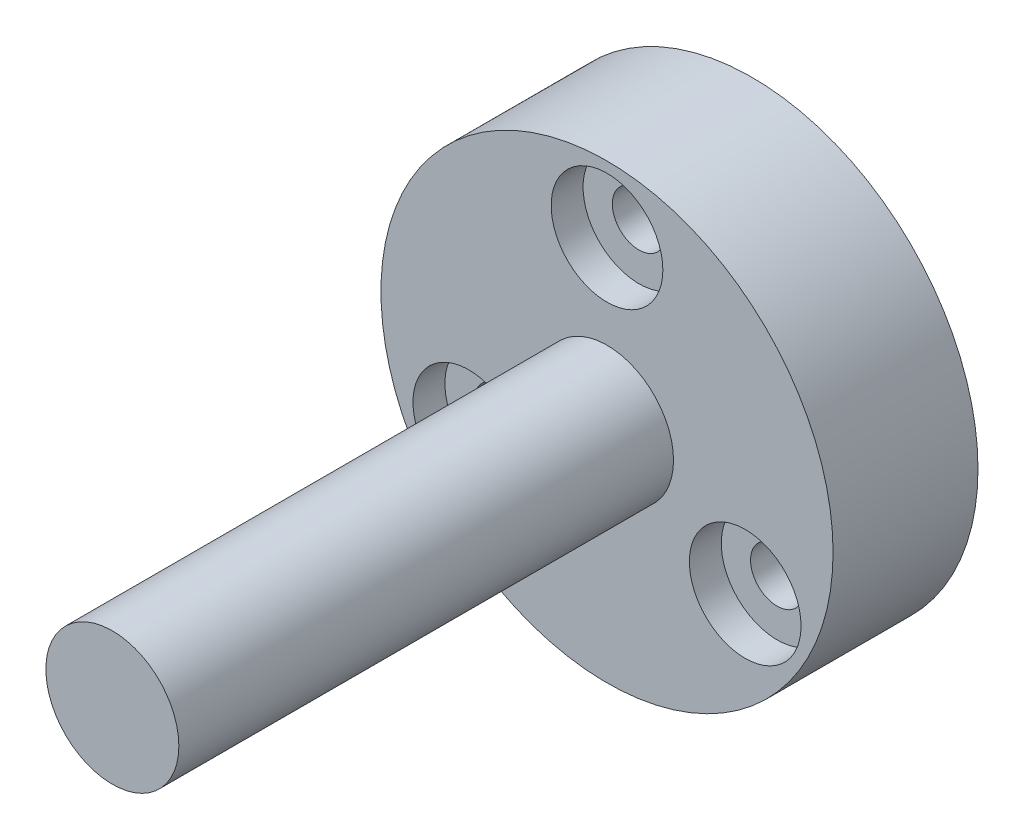
ISO-10303-21;
HEADER;
FILE_DESCRIPTION(('STEP AP214'),'2;1');
FILE_NAME('part.step','',(''),(''),'','','');
FILE_SCHEMA(('AUTOMOTIVE_DESIGN { 1 0 10303 214 1 1 1 1 }'));
ENDSEC;
DATA;
#1=APPLICATION_CONTEXT('core data for automotive mechanical design processes');
#2=APPLICATION_PROTOCOL_DEFINITION('international standard','automotive_design',2000,#1);
#3=PRODUCT_CONTEXT('',#1,'mechanical');
#4=PRODUCT('Part','Part','',(#3));
#5=PRODUCT_RELATED_PRODUCT_CATEGORY('part','',(#4));
#6=PRODUCT_DEFINITION_FORMATION('','',#4);
#7=PRODUCT_DEFINITION_CONTEXT('part definition',#1,'design');
#8=PRODUCT_DEFINITION('design','',#6,#7);
#9=PRODUCT_DEFINITION_SHAPE('','',#8);
#10=(LENGTH_UNIT() NAMED_UNIT(*) SI_UNIT(.MILLI.,.METRE.));
#11=(NAMED_UNIT(*) PLANE_ANGLE_UNIT() SI_UNIT($,.RADIAN.));
#12=(NAMED_UNIT(*) SI_UNIT($,.STERADIAN.) SOLID_ANGLE_UNIT());
#13=UNCERTAINTY_MEASURE_WITH_UNIT(LENGTH_MEASURE(1.E-05),#10,'distance_accuracy_value','');
#14=(GEOMETRIC_REPRESENTATION_CONTEXT(3) GLOBAL_UNCERTAINTY_ASSIGNED_CONTEXT((#13)) GLOBAL_UNIT_ASSIGNED_CONTEXT((#10,
#11,#12)) REPRESENTATION_CONTEXT('',''));
#15=CARTESIAN_POINT('',(0.,0.,0.));
#16=DIRECTION('',(0.,0.,1.));
#17=DIRECTION('',(1.,0.,0.));
#18=AXIS2_PLACEMENT_3D('',#15,#16,#17);
#19=CARTESIAN_POINT('',(-5.19615242270646,-2.99999999999979,0.));
#20=DIRECTION('',(0.,0.,1.));
#21=DIRECTION('',(1.,0.,0.));
#22=AXIS2_PLACEMENT_3D('',#19,#20,#21);
#23=CYLINDRICAL_SURFACE('',#22,1.00000000000003);
#24=CARTESIAN_POINT('',(-5.19615242270646,-2.99999999999979,0.));
#25=DIRECTION('',(0.,0.,1.));
#26=DIRECTION('',(1.,0.,0.));
#27=AXIS2_PLACEMENT_3D('',#24,#25,#26);
#28=CIRCLE('',#27,1.00000000000003);
#29=CARTESIAN_POINT('',(-4.19615242270642,-2.99999999999979,0.));
#30=VERTEX_POINT('',#29);
#31=EDGE_CURVE('E54',#30,#30,#28,.T.);
#32=ORIENTED_EDGE('',*,*,#31,.F.);
#33=EDGE_LOOP('',(#32));
#34=FACE_BOUND('',#33,.T.);
#35=CARTESIAN_POINT('',(-5.19615242270646,-2.99999999999979,4.25));
#36=DIRECTION('',(0.,0.,1.));
#37=DIRECTION('',(1.,0.,0.));
#38=AXIS2_PLACEMENT_3D('',#35,#36,#37);
#39=CIRCLE('',#38,1.00000000000003);
#40=CARTESIAN_POINT('',(-4.19615242270642,-2.99999999999979,4.25));
#41=VERTEX_POINT('',#40);
#42=EDGE_CURVE('E40',#41,#41,#39,.F.);
#43=ORIENTED_EDGE('',*,*,#42,.F.);
#44=EDGE_LOOP('',(#43));
#45=FACE_BOUND('',#44,.T.);
#46=ADVANCED_FACE('F36',(#34,#45),#23,.F.);
#47=CARTESIAN_POINT('',(5.19615242270653,-2.99999999999974,0.));
#48=DIRECTION('',(0.,0.,1.));
#49=DIRECTION('',(1.,0.,0.));
#50=AXIS2_PLACEMENT_3D('',#47,#48,#49);
#51=CYLINDRICAL_SURFACE('',#50,1.00000000000026);
#52=CARTESIAN_POINT('',(5.19615242270653,-2.99999999999974,0.));
#53=DIRECTION('',(0.,0.,1.));
#54=DIRECTION('',(1.,0.,0.));
#55=AXIS2_PLACEMENT_3D('',#52,#53,#54);
#56=CIRCLE('',#55,1.00000000000026);
#57=CARTESIAN_POINT('',(6.19615242270679,-2.99999999999974,0.));
#58=VERTEX_POINT('',#57);
#59=EDGE_CURVE('E84',#58,#58,#56,.T.);
#60=ORIENTED_EDGE('',*,*,#59,.F.);
#61=EDGE_LOOP('',(#60));
#62=FACE_BOUND('',#61,.T.);
#63=CARTESIAN_POINT('',(5.19615242270653,-2.99999999999974,4.25));
#64=DIRECTION('',(0.,0.,1.));
#65=DIRECTION('',(1.,0.,0.));
#66=AXIS2_PLACEMENT_3D('',#63,#64,#65);
#67=CIRCLE('',#66,1.00000000000026);
#68=CARTESIAN_POINT('',(6.19615242270679,-2.99999999999974,4.25));
#69=VERTEX_POINT('',#68);
#70=EDGE_CURVE('E60',#69,#69,#67,.F.);
#71=ORIENTED_EDGE('',*,*,#70,.F.);
#72=EDGE_LOOP('',(#71));
#73=FACE_BOUND('',#72,.T.);
#74=ADVANCED_FACE('F98',(#62,#73),#51,.F.);
#75=CARTESIAN_POINT('',(0.,6.,0.));
#76=DIRECTION('',(0.,0.,1.));
#77=DIRECTION('',(1.,0.,0.));
#78=AXIS2_PLACEMENT_3D('',#75,#76,#77);
#79=CYLINDRICAL_SURFACE('',#78,1.);
#80=CARTESIAN_POINT('',(0.,6.,0.));
#81=DIRECTION('',(0.,0.,1.));
#82=DIRECTION('',(1.,0.,0.));
#83=AXIS2_PLACEMENT_3D('',#80,#81,#82);
#84=CIRCLE('',#83,1.);
#85=CARTESIAN_POINT('',(1.,6.,0.));
#86=VERTEX_POINT('',#85);
#87=EDGE_CURVE('E51',#86,#86,#84,.T.);
#88=ORIENTED_EDGE('',*,*,#87,.F.);
#89=EDGE_LOOP('',(#88));
#90=FACE_BOUND('',#89,.T.);
#91=CARTESIAN_POINT('',(0.,6.,4.25));
#92=DIRECTION('',(0.,0.,1.));
#93=DIRECTION('',(1.,0.,0.));
#94=AXIS2_PLACEMENT_3D('',#91,#92,#93);
#95=CIRCLE('',#94,1.);
#96=CARTESIAN_POINT('',(1.,6.,4.25));
#97=VERTEX_POINT('',#96);
#98=EDGE_CURVE('E57',#97,#97,#95,.F.);
#99=ORIENTED_EDGE('',*,*,#98,.F.);
#100=EDGE_LOOP('',(#99));
#101=FACE_BOUND('',#100,.T.);
#102=ADVANCED_FACE('F104',(#90,#101),#79,.F.);
#103=CARTESIAN_POINT('',(0.,0.,5.45));
#104=DIRECTION('',(0.,0.,-1.));
#105=DIRECTION('',(-1.,0.,0.));
#106=AXIS2_PLACEMENT_3D('',#103,#104,#105);
#107=CYLINDRICAL_SURFACE('',#106,8.50000000000001);
#108=CARTESIAN_POINT('',(0.,0.,5.45));
#109=DIRECTION('',(0.,0.,1.));
#110=DIRECTION('',(1.,0.,0.));
#111=AXIS2_PLACEMENT_3D('',#108,#109,#110);
#112=CIRCLE('',#111,8.50000000000001);
#113=CARTESIAN_POINT('',(8.50000000000001,0.,5.45));
#114=VERTEX_POINT('',#113);
#115=EDGE_CURVE('E10',#114,#114,#112,.T.);
#116=ORIENTED_EDGE('',*,*,#115,.F.);
#117=EDGE_LOOP('',(#116));
#118=FACE_BOUND('',#117,.T.);
#119=CARTESIAN_POINT('',(0.,0.,0.));
#120=DIRECTION('',(0.,0.,1.));
#121=DIRECTION('',(1.,0.,0.));
#122=AXIS2_PLACEMENT_3D('',#119,#120,#121);
#123=CIRCLE('',#122,8.50000000000001);
#124=CARTESIAN_POINT('',(8.50000000000001,0.,0.));
#125=VERTEX_POINT('',#124);
#126=EDGE_CURVE('E45',#125,#125,#123,.T.);
#127=ORIENTED_EDGE('',*,*,#126,.T.);
#128=EDGE_LOOP('',(#127));
#129=FACE_BOUND('',#128,.T.);
#130=ADVANCED_FACE('F38',(#118,#129),#107,.T.);
#131=CARTESIAN_POINT('',(0.,0.,5.45));
#132=DIRECTION('',(0.,0.,1.));
#133=DIRECTION('',(1.,0.,0.));
#134=AXIS2_PLACEMENT_3D('',#131,#132,#133);
#135=PLANE('',#134);
#136=CARTESIAN_POINT('',(5.19615242270653,-2.99999999999974,5.45));
#137=DIRECTION('',(0.,0.,1.));
#138=DIRECTION('',(1.,0.,0.));
#139=AXIS2_PLACEMENT_3D('',#136,#137,#138);
#140=CIRCLE('',#139,2.1);
#141=CARTESIAN_POINT('',(7.29615242270653,-2.99999999999974,5.45));
#142=VERTEX_POINT('',#141);
#143=EDGE_CURVE('E189',#142,#142,#140,.T.);
#144=ORIENTED_EDGE('',*,*,#143,.F.);
#145=EDGE_LOOP('',(#144));
#146=FACE_BOUND('',#145,.T.);
#147=CARTESIAN_POINT('',(0.,6.,5.45));
#148=DIRECTION('',(0.,0.,1.));
#149=DIRECTION('',(1.,0.,0.));
#150=AXIS2_PLACEMENT_3D('',#147,#148,#149);
#151=CIRCLE('',#150,2.1);
#152=CARTESIAN_POINT('',(2.1,6.,5.45));
#153=VERTEX_POINT('',#152);
#154=EDGE_CURVE('E178',#153,#153,#151,.T.);
#155=ORIENTED_EDGE('',*,*,#154,.F.);
#156=EDGE_LOOP('',(#155));
#157=FACE_BOUND('',#156,.T.);
#158=CARTESIAN_POINT('',(-5.19615242270646,-2.99999999999979,5.45));
#159=DIRECTION('',(0.,0.,1.));
#160=DIRECTION('',(1.,0.,0.));
#161=AXIS2_PLACEMENT_3D('',#158,#159,#160);
#162=CIRCLE('',#161,2.1);
#163=CARTESIAN_POINT('',(-3.09615242270646,-2.99999999999979,5.45));
#164=VERTEX_POINT('',#163);
#165=EDGE_CURVE('E172',#164,#164,#162,.T.);
#166=ORIENTED_EDGE('',*,*,#165,.F.);
#167=EDGE_LOOP('',(#166));
#168=FACE_BOUND('',#167,.T.);
#169=CARTESIAN_POINT('',(0.,0.,5.45));
#170=DIRECTION('',(0.,0.,1.));
#171=DIRECTION('',(1.,0.,0.));
#172=AXIS2_PLACEMENT_3D('',#169,#170,#171);
#173=CIRCLE('',#172,2.5);
#174=CARTESIAN_POINT('',(2.5,0.,5.45));
#175=VERTEX_POINT('',#174);
#176=EDGE_CURVE('E68',#175,#175,#173,.T.);
#177=ORIENTED_EDGE('',*,*,#176,.F.);
#178=EDGE_LOOP('',(#177));
#179=FACE_BOUND('',#178,.T.);
#180=ORIENTED_EDGE('',*,*,#115,.T.);
#181=EDGE_LOOP('',(#180));
#182=FACE_BOUND('',#181,.T.);
#183=ADVANCED_FACE('F109',(#146,#157,#168,#179,#182),#135,.T.);
#184=CARTESIAN_POINT('',(0.,0.,0.));
#185=DIRECTION('',(0.,0.,1.));
#186=DIRECTION('',(1.,0.,0.));
#187=AXIS2_PLACEMENT_3D('',#184,#185,#186);
#188=PLANE('',#187);
#189=CARTESIAN_POINT('',(0.,0.,0.));
#190=DIRECTION('',(0.,0.,-1.));
#191=DIRECTION('',(-1.,0.,0.));
#192=AXIS2_PLACEMENT_3D('',#189,#190,#191);
#193=CIRCLE('',#192,4.5);
#194=CARTESIAN_POINT('',(-4.5,0.,0.));
#195=VERTEX_POINT('',#194);
#196=EDGE_CURVE('E126',#195,#195,#193,.T.);
#197=ORIENTED_EDGE('',*,*,#196,.F.);
#198=EDGE_LOOP('',(#197));
#199=FACE_BOUND('',#198,.T.);
#200=ORIENTED_EDGE('',*,*,#87,.T.);
#201=EDGE_LOOP('',(#200));
#202=FACE_BOUND('',#201,.T.);
#203=ORIENTED_EDGE('',*,*,#59,.T.);
#204=EDGE_LOOP('',(#203));
#205=FACE_BOUND('',#204,.T.);
#206=ORIENTED_EDGE('',*,*,#31,.T.);
#207=EDGE_LOOP('',(#206));
#208=FACE_BOUND('',#207,.T.);
#209=ORIENTED_EDGE('',*,*,#126,.F.);
#210=EDGE_LOOP('',(#209));
#211=FACE_BOUND('',#210,.T.);
#212=ADVANCED_FACE('F93',(#199,#202,#205,#208,#211),#188,.F.);
#213=CARTESIAN_POINT('',(0.,0.,24.05));
#214=DIRECTION('',(0.,0.,-1.));
#215=DIRECTION('',(-1.,0.,0.));
#216=AXIS2_PLACEMENT_3D('',#213,#214,#215);
#217=CYLINDRICAL_SURFACE('',#216,2.5);
#218=CARTESIAN_POINT('',(0.,0.,24.05));
#219=DIRECTION('',(0.,0.,1.));
#220=DIRECTION('',(1.,0.,0.));
#221=AXIS2_PLACEMENT_3D('',#218,#219,#220);
#222=CIRCLE('',#221,2.5);
#223=CARTESIAN_POINT('',(2.5,0.,24.05));
#224=VERTEX_POINT('',#223);
#225=EDGE_CURVE('E73',#224,#224,#222,.T.);
#226=ORIENTED_EDGE('',*,*,#225,.F.);
#227=EDGE_LOOP('',(#226));
#228=FACE_BOUND('',#227,.T.);
#229=ORIENTED_EDGE('',*,*,#176,.T.);
#230=EDGE_LOOP('',(#229));
#231=FACE_BOUND('',#230,.T.);
#232=ADVANCED_FACE('F113',(#228,#231),#217,.T.);
#233=CARTESIAN_POINT('',(0.,0.,24.05));
#234=DIRECTION('',(0.,0.,1.));
#235=DIRECTION('',(1.,0.,0.));
#236=AXIS2_PLACEMENT_3D('',#233,#234,#235);
#237=PLANE('',#236);
#238=ORIENTED_EDGE('',*,*,#225,.T.);
#239=EDGE_LOOP('',(#238));
#240=FACE_BOUND('',#239,.T.);
#241=ADVANCED_FACE('F120',(#240),#237,.T.);
#242=CARTESIAN_POINT('',(0.,6.,4.25));
#243=DIRECTION('',(0.,0.,1.));
#244=DIRECTION('',(1.,0.,0.));
#245=AXIS2_PLACEMENT_3D('',#242,#243,#244);
#246=PLANE('',#245);
#247=CARTESIAN_POINT('',(0.,6.,4.25));
#248=DIRECTION('',(0.,0.,1.));
#249=DIRECTION('',(1.,0.,0.));
#250=AXIS2_PLACEMENT_3D('',#247,#248,#249);
#251=CIRCLE('',#250,2.1);
#252=CARTESIAN_POINT('',(2.1,6.,4.25));
#253=VERTEX_POINT('',#252);
#254=EDGE_CURVE('E186',#253,#253,#251,.T.);
#255=ORIENTED_EDGE('',*,*,#254,.T.);
#256=EDGE_LOOP('',(#255));
#257=FACE_BOUND('',#256,.T.);
#258=ORIENTED_EDGE('',*,*,#98,.T.);
#259=EDGE_LOOP('',(#258));
#260=FACE_BOUND('',#259,.T.);
#261=ADVANCED_FACE('F133',(#257,#260),#246,.T.);
#262=CARTESIAN_POINT('',(0.,6.,4.25));
#263=DIRECTION('',(0.,0.,1.));
#264=DIRECTION('',(1.,0.,0.));
#265=AXIS2_PLACEMENT_3D('',#262,#263,#264);
#266=CYLINDRICAL_SURFACE('',#265,2.1);
#267=ORIENTED_EDGE('',*,*,#254,.F.);
#268=EDGE_LOOP('',(#267));
#269=FACE_BOUND('',#268,.T.);
#270=ORIENTED_EDGE('',*,*,#154,.T.);
#271=EDGE_LOOP('',(#270));
#272=FACE_BOUND('',#271,.T.);
#273=ADVANCED_FACE('F135',(#269,#272),#266,.F.);
#274=CARTESIAN_POINT('',(5.19615242270653,-2.99999999999974,4.25));
#275=DIRECTION('',(0.,0.,1.));
#276=DIRECTION('',(1.,0.,0.));
#277=AXIS2_PLACEMENT_3D('',#274,#275,#276);
#278=PLANE('',#277);
#279=CARTESIAN_POINT('',(5.19615242270653,-2.99999999999974,4.25));
#280=DIRECTION('',(0.,0.,1.));
#281=DIRECTION('',(1.,0.,0.));
#282=AXIS2_PLACEMENT_3D('',#279,#280,#281);
#283=CIRCLE('',#282,2.1);
#284=CARTESIAN_POINT('',(7.29615242270653,-2.99999999999974,4.25));
#285=VERTEX_POINT('',#284);
#286=EDGE_CURVE('E61',#285,#285,#283,.T.);
#287=ORIENTED_EDGE('',*,*,#286,.T.);
#288=EDGE_LOOP('',(#287));
#289=FACE_BOUND('',#288,.T.);
#290=ORIENTED_EDGE('',*,*,#70,.T.);
#291=EDGE_LOOP('',(#290));
#292=FACE_BOUND('',#291,.T.);
#293=ADVANCED_FACE('F142',(#289,#292),#278,.T.);
#294=CARTESIAN_POINT('',(5.19615242270653,-2.99999999999974,4.25));
#295=DIRECTION('',(0.,0.,1.));
#296=DIRECTION('',(1.,0.,0.));
#297=AXIS2_PLACEMENT_3D('',#294,#295,#296);
#298=CYLINDRICAL_SURFACE('',#297,2.1);
#299=ORIENTED_EDGE('',*,*,#286,.F.);
#300=EDGE_LOOP('',(#299));
#301=FACE_BOUND('',#300,.T.);
#302=ORIENTED_EDGE('',*,*,#143,.T.);
#303=EDGE_LOOP('',(#302));
#304=FACE_BOUND('',#303,.T.);
#305=ADVANCED_FACE('F150',(#301,#304),#298,.F.);
#306=CARTESIAN_POINT('',(-5.19615242270646,-2.99999999999979,4.25));
#307=DIRECTION('',(0.,0.,1.));
#308=DIRECTION('',(1.,0.,0.));
#309=AXIS2_PLACEMENT_3D('',#306,#307,#308);
#310=PLANE('',#309);
#311=CARTESIAN_POINT('',(-5.19615242270646,-2.99999999999979,4.25));
#312=DIRECTION('',(0.,0.,1.));
#313=DIRECTION('',(1.,0.,0.));
#314=AXIS2_PLACEMENT_3D('',#311,#312,#313);
#315=CIRCLE('',#314,2.1);
#316=CARTESIAN_POINT('',(-3.09615242270646,-2.99999999999979,4.25));
#317=VERTEX_POINT('',#316);
#318=EDGE_CURVE('E169',#317,#317,#315,.T.);
#319=ORIENTED_EDGE('',*,*,#318,.T.);
#320=EDGE_LOOP('',(#319));
#321=FACE_BOUND('',#320,.T.);
#322=ORIENTED_EDGE('',*,*,#42,.T.);
#323=EDGE_LOOP('',(#322));
#324=FACE_BOUND('',#323,.T.);
#325=ADVANCED_FACE('F153',(#321,#324),#310,.T.);
#326=CARTESIAN_POINT('',(-5.19615242270646,-2.99999999999979,4.25));
#327=DIRECTION('',(0.,0.,1.));
#328=DIRECTION('',(1.,0.,0.));
#329=AXIS2_PLACEMENT_3D('',#326,#327,#328);
#330=CYLINDRICAL_SURFACE('',#329,2.1);
#331=ORIENTED_EDGE('',*,*,#318,.F.);
#332=EDGE_LOOP('',(#331));
#333=FACE_BOUND('',#332,.T.);
#334=ORIENTED_EDGE('',*,*,#165,.T.);
#335=EDGE_LOOP('',(#334));
#336=FACE_BOUND('',#335,.T.);
#337=ADVANCED_FACE('F156',(#333,#336),#330,.F.);
#338=CARTESIAN_POINT('',(0.,0.,2.));
#339=DIRECTION('',(0.,0.,-1.));
#340=DIRECTION('',(-1.,0.,0.));
#341=AXIS2_PLACEMENT_3D('',#338,#339,#340);
#342=CYLINDRICAL_SURFACE('',#341,4.5);
#343=CARTESIAN_POINT('',(0.,0.,2.));
#344=DIRECTION('',(0.,0.,-1.));
#345=DIRECTION('',(-1.,0.,0.));
#346=AXIS2_PLACEMENT_3D('',#343,#344,#345);
#347=CIRCLE('',#346,4.5);
#348=CARTESIAN_POINT('',(-4.5,0.,2.));
#349=VERTEX_POINT('',#348);
#350=EDGE_CURVE('E175',#349,#349,#347,.T.);
#351=ORIENTED_EDGE('',*,*,#350,.F.);
#352=EDGE_LOOP('',(#351));
#353=FACE_BOUND('',#352,.T.);
#354=ORIENTED_EDGE('',*,*,#196,.T.);
#355=EDGE_LOOP('',(#354));
#356=FACE_BOUND('',#355,.T.);
#357=ADVANCED_FACE('F159',(#353,#356),#342,.F.);
#358=CARTESIAN_POINT('',(0.,0.,2.));
#359=DIRECTION('',(0.,0.,-1.));
#360=DIRECTION('',(-1.,0.,0.));
#361=AXIS2_PLACEMENT_3D('',#358,#359,#360);
#362=PLANE('',#361);
#363=ORIENTED_EDGE('',*,*,#350,.T.);
#364=EDGE_LOOP('',(#363));
#365=FACE_BOUND('',#364,.T.);
#366=ADVANCED_FACE('F163',(#365),#362,.T.);
#367=CLOSED_SHELL('',(#46,#74,#102,#130,#183,#212,#232,#241,#261,#273,#293,#305,#325,#337,#357,#366));
#368=MANIFOLD_SOLID_BREP('B2',#367);
#369=ADVANCED_BREP_SHAPE_REPRESENTATION('',(#18,#368),#14);
#370=SHAPE_DEFINITION_REPRESENTATION(#9,#369);
ENDSEC;
END-ISO-10303-21;
